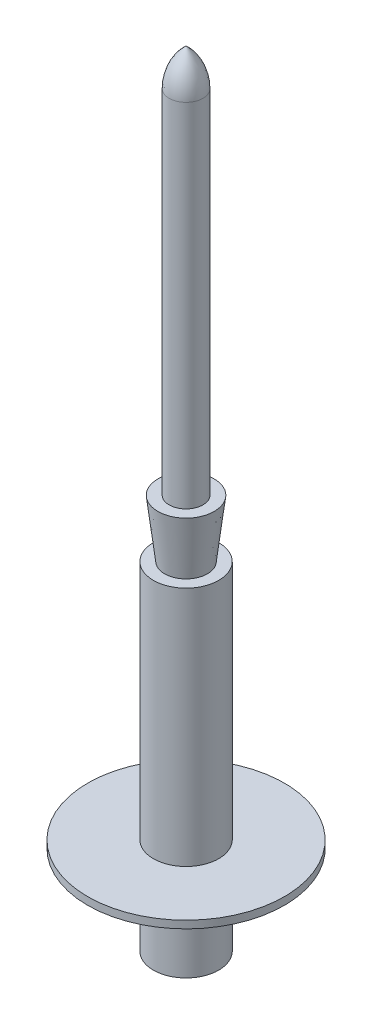
ISO-10303-21;
HEADER;
FILE_DESCRIPTION(('STEP AP214'),'2;1');
FILE_NAME('part.step','',(''),(''),'','','');
FILE_SCHEMA(('AUTOMOTIVE_DESIGN { 1 0 10303 214 1 1 1 1 }'));
ENDSEC;
DATA;
#1=APPLICATION_CONTEXT('core data for automotive mechanical design processes');
#2=APPLICATION_PROTOCOL_DEFINITION('international standard','automotive_design',2000,#1);
#3=PRODUCT_CONTEXT('',#1,'mechanical');
#4=PRODUCT('Part','Part','',(#3));
#5=PRODUCT_RELATED_PRODUCT_CATEGORY('part','',(#4));
#6=PRODUCT_DEFINITION_FORMATION('','',#4);
#7=PRODUCT_DEFINITION_CONTEXT('part definition',#1,'design');
#8=PRODUCT_DEFINITION('design','',#6,#7);
#9=PRODUCT_DEFINITION_SHAPE('','',#8);
#10=(LENGTH_UNIT() NAMED_UNIT(*) SI_UNIT(.MILLI.,.METRE.));
#11=(NAMED_UNIT(*) PLANE_ANGLE_UNIT() SI_UNIT($,.RADIAN.));
#12=(NAMED_UNIT(*) SI_UNIT($,.STERADIAN.) SOLID_ANGLE_UNIT());
#13=UNCERTAINTY_MEASURE_WITH_UNIT(LENGTH_MEASURE(1.E-05),#10,'distance_accuracy_value','');
#14=(GEOMETRIC_REPRESENTATION_CONTEXT(3) GLOBAL_UNCERTAINTY_ASSIGNED_CONTEXT((#13)) GLOBAL_UNIT_ASSIGNED_CONTEXT((#10,
#11,#12)) REPRESENTATION_CONTEXT('',''));
#15=CARTESIAN_POINT('',(0.,0.,0.));
#16=DIRECTION('',(0.,0.,1.));
#17=DIRECTION('',(1.,0.,0.));
#18=AXIS2_PLACEMENT_3D('',#15,#16,#17);
#19=CARTESIAN_POINT('',(0.,0.,0.));
#20=DIRECTION('',(0.,1.,0.));
#21=DIRECTION('',(0.,0.,1.));
#22=AXIS2_PLACEMENT_3D('',#19,#20,#21);
#23=PLANE('',#22);
#24=CARTESIAN_POINT('',(0.,0.,0.));
#25=DIRECTION('',(0.,1.,0.));
#26=DIRECTION('',(0.,0.,1.));
#27=AXIS2_PLACEMENT_3D('',#24,#25,#26);
#28=CIRCLE('',#27,2.9);
#29=CARTESIAN_POINT('',(0.,0.,2.9));
#30=VERTEX_POINT('',#29);
#31=EDGE_CURVE('E11',#30,#30,#28,.T.);
#32=ORIENTED_EDGE('',*,*,#31,.F.);
#33=EDGE_LOOP('',(#32));
#34=FACE_BOUND('',#33,.T.);
#35=ADVANCED_FACE('F38',(#34),#23,.F.);
#36=CARTESIAN_POINT('',(0.,69.5986072281651,0.));
#37=DIRECTION('',(0.,1.,0.));
#38=DIRECTION('',(0.,0.,1.));
#39=AXIS2_PLACEMENT_3D('',#36,#37,#38);
#40=CYLINDRICAL_SURFACE('',#39,2.9);
#41=CARTESIAN_POINT('',(0.,7.9,0.));
#42=DIRECTION('',(0.,1.,0.));
#43=DIRECTION('',(0.,0.,1.));
#44=AXIS2_PLACEMENT_3D('',#41,#42,#43);
#45=CIRCLE('',#44,2.9);
#46=CARTESIAN_POINT('',(0.,7.9,2.9));
#47=VERTEX_POINT('',#46);
#48=EDGE_CURVE('E44',#47,#47,#45,.T.);
#49=ORIENTED_EDGE('',*,*,#48,.F.);
#50=EDGE_LOOP('',(#49));
#51=FACE_BOUND('',#50,.T.);
#52=ORIENTED_EDGE('',*,*,#31,.T.);
#53=EDGE_LOOP('',(#52));
#54=FACE_BOUND('',#53,.T.);
#55=ADVANCED_FACE('F83',(#51,#54),#40,.T.);
#56=CARTESIAN_POINT('',(2.9,7.9,0.));
#57=DIRECTION('',(0.,1.,0.));
#58=DIRECTION('',(0.,0.,1.));
#59=AXIS2_PLACEMENT_3D('',#56,#57,#58);
#60=PLANE('',#59);
#61=CARTESIAN_POINT('',(0.,7.9,0.));
#62=DIRECTION('',(0.,1.,0.));
#63=DIRECTION('',(0.,0.,1.));
#64=AXIS2_PLACEMENT_3D('',#61,#62,#63);
#65=CIRCLE('',#64,8.73286490677104);
#66=CARTESIAN_POINT('',(0.,7.9,8.73286490677104));
#67=VERTEX_POINT('',#66);
#68=EDGE_CURVE('E76',#67,#67,#65,.T.);
#69=ORIENTED_EDGE('',*,*,#68,.F.);
#70=EDGE_LOOP('',(#69));
#71=FACE_BOUND('',#70,.T.);
#72=ORIENTED_EDGE('',*,*,#48,.T.);
#73=EDGE_LOOP('',(#72));
#74=FACE_BOUND('',#73,.T.);
#75=ADVANCED_FACE('F81',(#71,#74),#60,.F.);
#76=CARTESIAN_POINT('',(0.,69.5986072281651,0.));
#77=DIRECTION('',(0.,1.,0.));
#78=DIRECTION('',(0.,0.,1.));
#79=AXIS2_PLACEMENT_3D('',#76,#77,#78);
#80=CYLINDRICAL_SURFACE('',#79,8.73286490677104);
#81=CARTESIAN_POINT('',(0.,8.57,0.));
#82=DIRECTION('',(0.,1.,0.));
#83=DIRECTION('',(0.,0.,1.));
#84=AXIS2_PLACEMENT_3D('',#81,#82,#83);
#85=CIRCLE('',#84,8.73286490677104);
#86=CARTESIAN_POINT('',(0.,8.57,8.73286490677104));
#87=VERTEX_POINT('',#86);
#88=EDGE_CURVE('E73',#87,#87,#85,.T.);
#89=ORIENTED_EDGE('',*,*,#88,.F.);
#90=EDGE_LOOP('',(#89));
#91=FACE_BOUND('',#90,.T.);
#92=ORIENTED_EDGE('',*,*,#68,.T.);
#93=EDGE_LOOP('',(#92));
#94=FACE_BOUND('',#93,.T.);
#95=ADVANCED_FACE('F101',(#91,#94),#80,.T.);
#96=CARTESIAN_POINT('',(8.73286490677104,8.57,0.));
#97=DIRECTION('',(0.,-1.,0.));
#98=DIRECTION('',(0.,0.,-1.));
#99=AXIS2_PLACEMENT_3D('',#96,#97,#98);
#100=PLANE('',#99);
#101=CARTESIAN_POINT('',(0.,8.56999999999999,0.));
#102=DIRECTION('',(0.,1.,0.));
#103=DIRECTION('',(0.,0.,1.));
#104=AXIS2_PLACEMENT_3D('',#101,#102,#103);
#105=CIRCLE('',#104,2.90000000000001);
#106=CARTESIAN_POINT('',(0.,8.56999999999999,2.90000000000001));
#107=VERTEX_POINT('',#106);
#108=EDGE_CURVE('E70',#107,#107,#105,.T.);
#109=ORIENTED_EDGE('',*,*,#108,.F.);
#110=EDGE_LOOP('',(#109));
#111=FACE_BOUND('',#110,.T.);
#112=ORIENTED_EDGE('',*,*,#88,.T.);
#113=EDGE_LOOP('',(#112));
#114=FACE_BOUND('',#113,.T.);
#115=ADVANCED_FACE('F109',(#111,#114),#100,.F.);
#116=CARTESIAN_POINT('',(0.,69.5986072281651,0.));
#117=DIRECTION('',(0.,1.,0.));
#118=DIRECTION('',(0.,0.,1.));
#119=AXIS2_PLACEMENT_3D('',#116,#117,#118);
#120=CYLINDRICAL_SURFACE('',#119,2.90000000000001);
#121=CARTESIAN_POINT('',(0.,29.97,0.));
#122=DIRECTION('',(0.,1.,0.));
#123=DIRECTION('',(0.,0.,1.));
#124=AXIS2_PLACEMENT_3D('',#121,#122,#123);
#125=CIRCLE('',#124,2.90000000000001);
#126=CARTESIAN_POINT('',(0.,29.97,2.90000000000001));
#127=VERTEX_POINT('',#126);
#128=EDGE_CURVE('E67',#127,#127,#125,.T.);
#129=ORIENTED_EDGE('',*,*,#128,.F.);
#130=EDGE_LOOP('',(#129));
#131=FACE_BOUND('',#130,.T.);
#132=ORIENTED_EDGE('',*,*,#108,.T.);
#133=EDGE_LOOP('',(#132));
#134=FACE_BOUND('',#133,.T.);
#135=ADVANCED_FACE('F117',(#131,#134),#120,.T.);
#136=CARTESIAN_POINT('',(2.90000000000001,29.97,0.));
#137=DIRECTION('',(0.,-1.,0.));
#138=DIRECTION('',(0.,0.,-1.));
#139=AXIS2_PLACEMENT_3D('',#136,#137,#138);
#140=PLANE('',#139);
#141=CARTESIAN_POINT('',(0.,29.97,0.));
#142=DIRECTION('',(0.,1.,0.));
#143=DIRECTION('',(0.,0.,1.));
#144=AXIS2_PLACEMENT_3D('',#141,#142,#143);
#145=CIRCLE('',#144,1.90000000000001);
#146=CARTESIAN_POINT('',(0.,29.97,1.90000000000001));
#147=VERTEX_POINT('',#146);
#148=EDGE_CURVE('E64',#147,#147,#145,.T.);
#149=ORIENTED_EDGE('',*,*,#148,.F.);
#150=EDGE_LOOP('',(#149));
#151=FACE_BOUND('',#150,.T.);
#152=ORIENTED_EDGE('',*,*,#128,.T.);
#153=EDGE_LOOP('',(#152));
#154=FACE_BOUND('',#153,.T.);
#155=ADVANCED_FACE('F125',(#151,#154),#140,.F.);
#156=CARTESIAN_POINT('',(0.,29.97,0.));
#157=DIRECTION('',(0.,1.,0.));
#158=DIRECTION('',(0.,0.,1.));
#159=AXIS2_PLACEMENT_3D('',#156,#157,#158);
#160=CONICAL_SURFACE('',#159,1.90000000000001,0.11710874456686);
#161=CARTESIAN_POINT('',(0.,35.07,0.));
#162=DIRECTION('',(0.,1.,0.));
#163=DIRECTION('',(0.,0.,1.));
#164=AXIS2_PLACEMENT_3D('',#161,#162,#163);
#165=CIRCLE('',#164,2.49999999999998);
#166=CARTESIAN_POINT('',(0.,35.07,2.49999999999998));
#167=VERTEX_POINT('',#166);
#168=EDGE_CURVE('E59',#167,#167,#165,.T.);
#169=ORIENTED_EDGE('',*,*,#168,.F.);
#170=EDGE_LOOP('',(#169));
#171=FACE_BOUND('',#170,.T.);
#172=ORIENTED_EDGE('',*,*,#148,.T.);
#173=EDGE_LOOP('',(#172));
#174=FACE_BOUND('',#173,.T.);
#175=ADVANCED_FACE('F133',(#171,#174),#160,.T.);
#176=CARTESIAN_POINT('',(2.49999999999998,35.07,0.));
#177=DIRECTION('',(0.,-1.,0.));
#178=DIRECTION('',(0.,0.,-1.));
#179=AXIS2_PLACEMENT_3D('',#176,#177,#178);
#180=PLANE('',#179);
#181=CARTESIAN_POINT('',(0.,35.07,0.));
#182=DIRECTION('',(0.,1.,0.));
#183=DIRECTION('',(0.,0.,1.));
#184=AXIS2_PLACEMENT_3D('',#181,#182,#183);
#185=CIRCLE('',#184,1.49999999999998);
#186=CARTESIAN_POINT('',(0.,35.07,1.49999999999998));
#187=VERTEX_POINT('',#186);
#188=EDGE_CURVE('E56',#187,#187,#185,.T.);
#189=ORIENTED_EDGE('',*,*,#188,.F.);
#190=EDGE_LOOP('',(#189));
#191=FACE_BOUND('',#190,.T.);
#192=ORIENTED_EDGE('',*,*,#168,.T.);
#193=EDGE_LOOP('',(#192));
#194=FACE_BOUND('',#193,.T.);
#195=ADVANCED_FACE('F141',(#191,#194),#180,.F.);
#196=CARTESIAN_POINT('',(0.,69.5986072281651,0.));
#197=DIRECTION('',(0.,1.,0.));
#198=DIRECTION('',(0.,0.,1.));
#199=AXIS2_PLACEMENT_3D('',#196,#197,#198);
#200=CYLINDRICAL_SURFACE('',#199,1.49999999999999);
#201=CARTESIAN_POINT('',(0.,66.3238342811393,0.));
#202=DIRECTION('',(0.,1.,0.));
#203=DIRECTION('',(0.,0.,1.));
#204=AXIS2_PLACEMENT_3D('',#201,#202,#203);
#205=CIRCLE('',#204,1.49999999999999);
#206=CARTESIAN_POINT('',(0.,66.3238342811393,1.49999999999999));
#207=VERTEX_POINT('',#206);
#208=EDGE_CURVE('E54',#207,#207,#205,.T.);
#209=ORIENTED_EDGE('',*,*,#208,.F.);
#210=EDGE_LOOP('',(#209));
#211=FACE_BOUND('',#210,.T.);
#212=ORIENTED_EDGE('',*,*,#188,.T.);
#213=EDGE_LOOP('',(#212));
#214=FACE_BOUND('',#213,.T.);
#215=ADVANCED_FACE('F50',(#211,#214),#200,.T.);
#216=CARTESIAN_POINT('',(0.,66.3238342811393,-2.8247126181908));
#217=DIRECTION('',(-1.,0.,0.));
#218=DIRECTION('',(0.,0.,1.));
#219=AXIS2_PLACEMENT_3D('',#216,#217,#218);
#220=CIRCLE('',#219,4.3247126181908);
#221=TRIMMED_CURVE('',#220,(PARAMETER_VALUE(-0.859051294127413)),
(PARAMETER_VALUE(0.859051294127413)),.T.,.PARAMETER.);
#222=CARTESIAN_POINT('',(0.,66.3238342811393,0.));
#223=DIRECTION('',(0.,1.,0.));
#224=AXIS1_PLACEMENT('',#222,#223);
#225=SURFACE_OF_REVOLUTION('',#221,#224);
#226=CARTESIAN_POINT('',(0.,69.5986072281651,0.));
#227=VERTEX_POINT('',#226);
#228=VERTEX_LOOP('',#227);
#229=FACE_BOUND('',#228,.T.);
#230=ORIENTED_EDGE('',*,*,#208,.T.);
#231=EDGE_LOOP('',(#230));
#232=FACE_BOUND('',#231,.T.);
#233=ADVANCED_FACE('F47',(#229,#232),#225,.T.);
#234=CLOSED_SHELL('',(#35,#55,#75,#95,#115,#135,#155,#175,#195,#215,#233));
#235=MANIFOLD_SOLID_BREP('B2',#234);
#236=ADVANCED_BREP_SHAPE_REPRESENTATION('',(#18,#235),#14);
#237=SHAPE_DEFINITION_REPRESENTATION(#9,#236);
ENDSEC;
END-ISO-10303-21;
